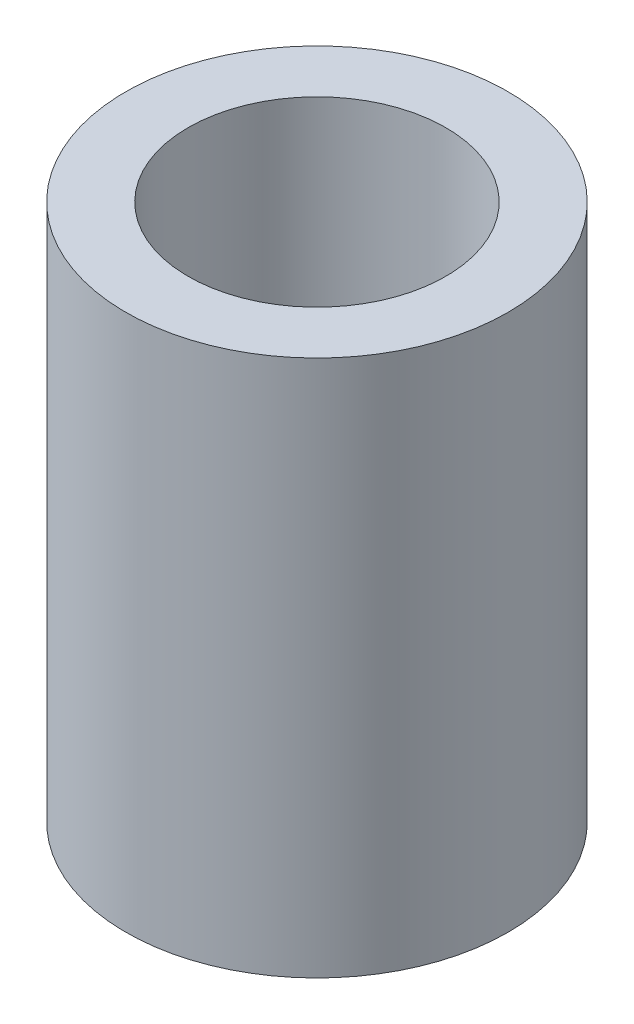
ISO-10303-21;
HEADER;
FILE_DESCRIPTION(('STEP AP214'),'2;1');
FILE_NAME('part.step','',(''),(''),'','','');
FILE_SCHEMA(('AUTOMOTIVE_DESIGN { 1 0 10303 214 1 1 1 1 }'));
ENDSEC;
DATA;
#1=APPLICATION_CONTEXT('core data for automotive mechanical design processes');
#2=APPLICATION_PROTOCOL_DEFINITION('international standard','automotive_design',2000,#1);
#3=PRODUCT_CONTEXT('',#1,'mechanical');
#4=PRODUCT('Part','Part','',(#3));
#5=PRODUCT_RELATED_PRODUCT_CATEGORY('part','',(#4));
#6=PRODUCT_DEFINITION_FORMATION('','',#4);
#7=PRODUCT_DEFINITION_CONTEXT('part definition',#1,'design');
#8=PRODUCT_DEFINITION('design','',#6,#7);
#9=PRODUCT_DEFINITION_SHAPE('','',#8);
#10=(LENGTH_UNIT() NAMED_UNIT(*) SI_UNIT(.MILLI.,.METRE.));
#11=(NAMED_UNIT(*) PLANE_ANGLE_UNIT() SI_UNIT($,.RADIAN.));
#12=(NAMED_UNIT(*) SI_UNIT($,.STERADIAN.) SOLID_ANGLE_UNIT());
#13=UNCERTAINTY_MEASURE_WITH_UNIT(LENGTH_MEASURE(1.E-05),#10,'distance_accuracy_value','');
#14=(GEOMETRIC_REPRESENTATION_CONTEXT(3) GLOBAL_UNCERTAINTY_ASSIGNED_CONTEXT((#13)) GLOBAL_UNIT_ASSIGNED_CONTEXT((#10,
#11,#12)) REPRESENTATION_CONTEXT('',''));
#15=CARTESIAN_POINT('',(0.,0.,0.));
#16=DIRECTION('',(0.,0.,1.));
#17=DIRECTION('',(1.,0.,0.));
#18=AXIS2_PLACEMENT_3D('',#15,#16,#17);
#19=CARTESIAN_POINT('',(8.9,0.,0.));
#20=DIRECTION('',(0.,-1.,0.));
#21=DIRECTION('',(1.,0.,0.));
#22=AXIS2_PLACEMENT_3D('',#19,#20,#21);
#23=PLANE('',#22);
#24=CARTESIAN_POINT('',(0.,0.,0.));
#25=DIRECTION('',(0.,-1.,0.));
#26=DIRECTION('',(1.,0.,0.));
#27=AXIS2_PLACEMENT_3D('',#24,#25,#26);
#28=CIRCLE('',#27,3.);
#29=CARTESIAN_POINT('',(3.,0.,0.));
#30=VERTEX_POINT('',#29);
#31=EDGE_CURVE('E52',#30,#30,#28,.T.);
#32=ORIENTED_EDGE('',*,*,#31,.F.);
#33=EDGE_LOOP('',(#32));
#34=FACE_BOUND('',#33,.T.);
#35=CARTESIAN_POINT('',(0.,0.,0.));
#36=DIRECTION('',(0.,-1.,0.));
#37=DIRECTION('',(1.,0.,0.));
#38=AXIS2_PLACEMENT_3D('',#35,#36,#37);
#39=CIRCLE('',#38,8.9);
#40=CARTESIAN_POINT('',(8.9,0.,0.));
#41=VERTEX_POINT('',#40);
#42=EDGE_CURVE('E40',#41,#41,#39,.T.);
#43=ORIENTED_EDGE('',*,*,#42,.T.);
#44=EDGE_LOOP('',(#43));
#45=FACE_BOUND('',#44,.T.);
#46=ADVANCED_FACE('F33',(#34,#45),#23,.T.);
#47=CARTESIAN_POINT('',(0.,25.,0.));
#48=DIRECTION('',(0.,1.,0.));
#49=DIRECTION('',(-1.,0.,0.));
#50=AXIS2_PLACEMENT_3D('',#47,#48,#49);
#51=PLANE('',#50);
#52=CARTESIAN_POINT('',(0.,25.,0.));
#53=DIRECTION('',(0.,1.,0.));
#54=DIRECTION('',(-1.,0.,0.));
#55=AXIS2_PLACEMENT_3D('',#52,#53,#54);
#56=CIRCLE('',#55,6.);
#57=CARTESIAN_POINT('',(-6.,25.,0.));
#58=VERTEX_POINT('',#57);
#59=EDGE_CURVE('E47',#58,#58,#56,.T.);
#60=ORIENTED_EDGE('',*,*,#59,.F.);
#61=EDGE_LOOP('',(#60));
#62=FACE_BOUND('',#61,.T.);
#63=CARTESIAN_POINT('',(0.,25.,0.));
#64=DIRECTION('',(0.,-1.,0.));
#65=DIRECTION('',(1.,0.,0.));
#66=AXIS2_PLACEMENT_3D('',#63,#64,#65);
#67=CIRCLE('',#66,8.9);
#68=CARTESIAN_POINT('',(8.9,25.,0.));
#69=VERTEX_POINT('',#68);
#70=EDGE_CURVE('E10',#69,#69,#67,.T.);
#71=ORIENTED_EDGE('',*,*,#70,.F.);
#72=EDGE_LOOP('',(#71));
#73=FACE_BOUND('',#72,.T.);
#74=ADVANCED_FACE('F74',(#62,#73),#51,.T.);
#75=CARTESIAN_POINT('',(0.,0.,0.));
#76=DIRECTION('',(0.,-1.,0.));
#77=DIRECTION('',(1.,0.,0.));
#78=AXIS2_PLACEMENT_3D('',#75,#76,#77);
#79=CYLINDRICAL_SURFACE('',#78,8.9);
#80=ORIENTED_EDGE('',*,*,#70,.T.);
#81=EDGE_LOOP('',(#80));
#82=FACE_BOUND('',#81,.T.);
#83=ORIENTED_EDGE('',*,*,#42,.F.);
#84=EDGE_LOOP('',(#83));
#85=FACE_BOUND('',#84,.T.);
#86=ADVANCED_FACE('F70',(#82,#85),#79,.T.);
#87=CARTESIAN_POINT('',(0.,8.,0.));
#88=DIRECTION('',(0.,1.,0.));
#89=DIRECTION('',(-1.,0.,0.));
#90=AXIS2_PLACEMENT_3D('',#87,#88,#89);
#91=CYLINDRICAL_SURFACE('',#90,6.);
#92=CARTESIAN_POINT('',(0.,8.,0.));
#93=DIRECTION('',(0.,1.,0.));
#94=DIRECTION('',(-1.,0.,0.));
#95=AXIS2_PLACEMENT_3D('',#92,#93,#94);
#96=CIRCLE('',#95,6.);
#97=CARTESIAN_POINT('',(-6.,8.,0.));
#98=VERTEX_POINT('',#97);
#99=EDGE_CURVE('E44',#98,#98,#96,.T.);
#100=ORIENTED_EDGE('',*,*,#99,.F.);
#101=EDGE_LOOP('',(#100));
#102=FACE_BOUND('',#101,.T.);
#103=ORIENTED_EDGE('',*,*,#59,.T.);
#104=EDGE_LOOP('',(#103));
#105=FACE_BOUND('',#104,.T.);
#106=ADVANCED_FACE('F64',(#102,#105),#91,.F.);
#107=CARTESIAN_POINT('',(0.,8.,0.));
#108=DIRECTION('',(0.,1.,0.));
#109=DIRECTION('',(-1.,0.,0.));
#110=AXIS2_PLACEMENT_3D('',#107,#108,#109);
#111=PLANE('',#110);
#112=CARTESIAN_POINT('',(0.,8.,0.));
#113=DIRECTION('',(0.,1.,0.));
#114=DIRECTION('',(-1.,0.,0.));
#115=AXIS2_PLACEMENT_3D('',#112,#113,#114);
#116=CIRCLE('',#115,3.);
#117=CARTESIAN_POINT('',(-3.,8.,0.));
#118=VERTEX_POINT('',#117);
#119=EDGE_CURVE('E36',#118,#118,#116,.T.);
#120=ORIENTED_EDGE('',*,*,#119,.F.);
#121=EDGE_LOOP('',(#120));
#122=FACE_BOUND('',#121,.T.);
#123=ORIENTED_EDGE('',*,*,#99,.T.);
#124=EDGE_LOOP('',(#123));
#125=FACE_BOUND('',#124,.T.);
#126=ADVANCED_FACE('F61',(#122,#125),#111,.T.);
#127=CARTESIAN_POINT('',(0.,12.5,0.));
#128=DIRECTION('',(0.,-1.,0.));
#129=DIRECTION('',(1.,0.,0.));
#130=AXIS2_PLACEMENT_3D('',#127,#128,#129);
#131=CYLINDRICAL_SURFACE('',#130,3.);
#132=ORIENTED_EDGE('',*,*,#119,.T.);
#133=EDGE_LOOP('',(#132));
#134=FACE_BOUND('',#133,.T.);
#135=ORIENTED_EDGE('',*,*,#31,.T.);
#136=EDGE_LOOP('',(#135));
#137=FACE_BOUND('',#136,.T.);
#138=ADVANCED_FACE('F59',(#134,#137),#131,.F.);
#139=CLOSED_SHELL('',(#46,#74,#86,#106,#126,#138));
#140=MANIFOLD_SOLID_BREP('B2',#139);
#141=ADVANCED_BREP_SHAPE_REPRESENTATION('',(#18,#140),#14);
#142=SHAPE_DEFINITION_REPRESENTATION(#9,#141);
ENDSEC;
END-ISO-10303-21;
